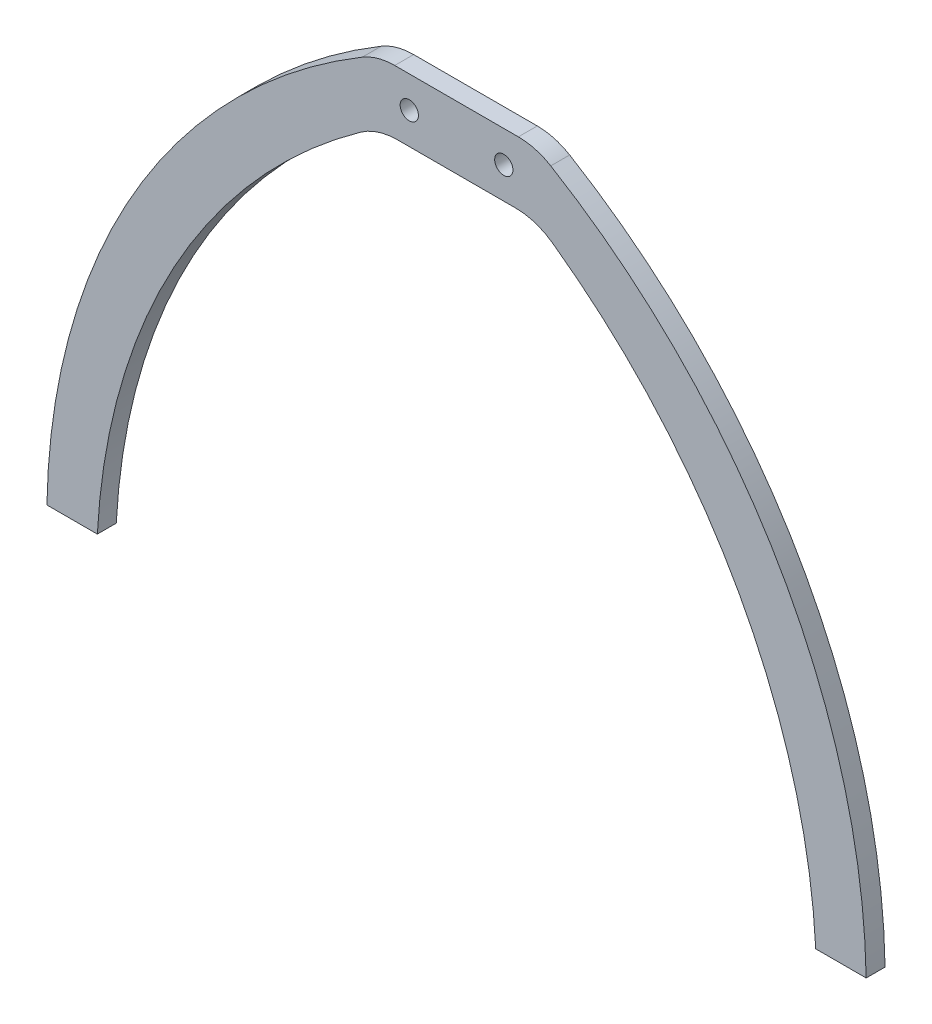
ISO-10303-21;
HEADER;
FILE_DESCRIPTION(('STEP AP214'),'2;1');
FILE_NAME('part.step','',(''),(''),'','','');
FILE_SCHEMA(('AUTOMOTIVE_DESIGN { 1 0 10303 214 1 1 1 1 }'));
ENDSEC;
DATA;
#1=APPLICATION_CONTEXT('core data for automotive mechanical design processes');
#2=APPLICATION_PROTOCOL_DEFINITION('international standard','automotive_design',2000,#1);
#3=PRODUCT_CONTEXT('',#1,'mechanical');
#4=PRODUCT('Part','Part','',(#3));
#5=PRODUCT_RELATED_PRODUCT_CATEGORY('part','',(#4));
#6=PRODUCT_DEFINITION_FORMATION('','',#4);
#7=PRODUCT_DEFINITION_CONTEXT('part definition',#1,'design');
#8=PRODUCT_DEFINITION('design','',#6,#7);
#9=PRODUCT_DEFINITION_SHAPE('','',#8);
#10=(LENGTH_UNIT() NAMED_UNIT(*) SI_UNIT(.MILLI.,.METRE.));
#11=(NAMED_UNIT(*) PLANE_ANGLE_UNIT() SI_UNIT($,.RADIAN.));
#12=(NAMED_UNIT(*) SI_UNIT($,.STERADIAN.) SOLID_ANGLE_UNIT());
#13=UNCERTAINTY_MEASURE_WITH_UNIT(LENGTH_MEASURE(1.E-05),#10,'distance_accuracy_value','');
#14=(GEOMETRIC_REPRESENTATION_CONTEXT(3) GLOBAL_UNCERTAINTY_ASSIGNED_CONTEXT((#13)) GLOBAL_UNIT_ASSIGNED_CONTEXT((#10,
#11,#12)) REPRESENTATION_CONTEXT('',''));
#15=CARTESIAN_POINT('',(0.,0.,0.));
#16=DIRECTION('',(0.,0.,1.));
#17=DIRECTION('',(1.,0.,0.));
#18=AXIS2_PLACEMENT_3D('',#15,#16,#17);
#19=CARTESIAN_POINT('',(55.3606240504215,-83.2778560287661,3.));
#20=DIRECTION('',(0.,0.,1.));
#21=DIRECTION('',(1.,0.,0.));
#22=AXIS2_PLACEMENT_3D('',#19,#20,#21);
#23=PLANE('',#22);
#24=CARTESIAN_POINT('',(5.00000000000002,5.,3.));
#25=DIRECTION('',(0.,0.,1.));
#26=DIRECTION('',(1.,0.,0.));
#27=AXIS2_PLACEMENT_3D('',#24,#25,#26);
#28=CIRCLE('',#27,1.45);
#29=CARTESIAN_POINT('',(6.45000000000001,5.,3.));
#30=VERTEX_POINT('',#29);
#31=EDGE_CURVE('E172',#30,#30,#28,.T.);
#32=ORIENTED_EDGE('',*,*,#31,.F.);
#33=EDGE_LOOP('',(#32));
#34=FACE_BOUND('',#33,.T.);
#35=CARTESIAN_POINT('',(-25.4846323681251,-79.7791840832565,3.));
#36=DIRECTION('',(0.,0.,1.));
#37=DIRECTION('',(-1.,0.,0.));
#38=AXIS2_PLACEMENT_3D('',#35,#36,#37);
#39=CIRCLE('',#38,103.);
#40=CARTESIAN_POINT('',(77.5,-78.,3.));
#41=VERTEX_POINT('',#40);
#42=CARTESIAN_POINT('',(27.4486852804393,8.57840689067273,3.));
#43=VERTEX_POINT('',#42);
#44=EDGE_CURVE('E156',#41,#43,#39,.T.);
#45=ORIENTED_EDGE('',*,*,#44,.T.);
#46=CARTESIAN_POINT('',(22.3095282271806,0.,3.));
#47=DIRECTION('',(0.,0.,1.));
#48=DIRECTION('',(1.,0.,0.));
#49=AXIS2_PLACEMENT_3D('',#46,#47,#48);
#50=CIRCLE('',#49,10.);
#51=CARTESIAN_POINT('',(22.3095282271806,10.,3.));
#52=VERTEX_POINT('',#51);
#53=EDGE_CURVE('E213',#43,#52,#50,.T.);
#54=ORIENTED_EDGE('',*,*,#53,.T.);
#55=DIRECTION('',(-1.,0.,0.));
#56=VECTOR('',#55,1.);
#57=CARTESIAN_POINT('',(0.,10.,3.));
#58=LINE('',#57,#56);
#59=CARTESIAN_POINT('',(2.69047177281938,10.,3.));
#60=VERTEX_POINT('',#59);
#61=EDGE_CURVE('E158',#52,#60,#58,.T.);
#62=ORIENTED_EDGE('',*,*,#61,.T.);
#63=CARTESIAN_POINT('',(2.69047177281938,0.,3.));
#64=DIRECTION('',(0.,0.,1.));
#65=DIRECTION('',(1.,0.,0.));
#66=AXIS2_PLACEMENT_3D('',#63,#64,#65);
#67=CIRCLE('',#66,10.);
#68=CARTESIAN_POINT('',(-2.4486852804393,8.57840689067274,3.));
#69=VERTEX_POINT('',#68);
#70=EDGE_CURVE('E56',#60,#69,#67,.T.);
#71=ORIENTED_EDGE('',*,*,#70,.T.);
#72=CARTESIAN_POINT('',(50.4846323681251,-79.7791840832565,3.));
#73=DIRECTION('',(0.,0.,1.));
#74=DIRECTION('',(1.,0.,0.));
#75=AXIS2_PLACEMENT_3D('',#72,#73,#74);
#76=CIRCLE('',#75,103.);
#77=CARTESIAN_POINT('',(-52.5,-78.,3.));
#78=VERTEX_POINT('',#77);
#79=EDGE_CURVE('E163',#69,#78,#76,.T.);
#80=ORIENTED_EDGE('',*,*,#79,.T.);
#81=DIRECTION('',(1.,0.,0.));
#82=VECTOR('',#81,1.);
#83=CARTESIAN_POINT('',(-52.5,-78.,3.));
#84=LINE('',#83,#82);
#85=CARTESIAN_POINT('',(-44.5,-78.,3.));
#86=VERTEX_POINT('',#85);
#87=EDGE_CURVE('E165',#78,#86,#84,.T.);
#88=ORIENTED_EDGE('',*,*,#87,.T.);
#89=CARTESIAN_POINT('',(55.3606240504215,-83.2778560287661,3.));
#90=DIRECTION('',(0.,0.,-1.));
#91=DIRECTION('',(1.,0.,0.));
#92=AXIS2_PLACEMENT_3D('',#89,#90,#91);
#93=CIRCLE('',#92,100.);
#94=CARTESIAN_POINT('',(-2.69805014361831,-1.85801599680376,3.));
#95=VERTEX_POINT('',#94);
#96=EDGE_CURVE('E187',#86,#95,#93,.T.);
#97=ORIENTED_EDGE('',*,*,#96,.T.);
#98=CARTESIAN_POINT('',(3.10781727578567,-9.99999999999999,3.));
#99=DIRECTION('',(0.,0.,1.));
#100=DIRECTION('',(1.,0.,0.));
#101=AXIS2_PLACEMENT_3D('',#98,#99,#100);
#102=CIRCLE('',#101,10.);
#103=CARTESIAN_POINT('',(3.10781727578567,0.,3.));
#104=VERTEX_POINT('',#103);
#105=EDGE_CURVE('E11',#95,#104,#102,.F.);
#106=ORIENTED_EDGE('',*,*,#105,.T.);
#107=DIRECTION('',(1.,0.,0.));
#108=VECTOR('',#107,1.);
#109=CARTESIAN_POINT('',(0.,0.,3.));
#110=LINE('',#109,#108);
#111=CARTESIAN_POINT('',(21.8921827242143,0.,3.));
#112=VERTEX_POINT('',#111);
#113=EDGE_CURVE('E142',#104,#112,#110,.T.);
#114=ORIENTED_EDGE('',*,*,#113,.T.);
#115=CARTESIAN_POINT('',(21.8921827242143,-9.99999999999999,3.));
#116=DIRECTION('',(0.,0.,1.));
#117=DIRECTION('',(1.,0.,0.));
#118=AXIS2_PLACEMENT_3D('',#115,#116,#117);
#119=CIRCLE('',#118,10.);
#120=CARTESIAN_POINT('',(27.6980501436183,-1.85801599680377,3.));
#121=VERTEX_POINT('',#120);
#122=EDGE_CURVE('E138',#112,#121,#119,.F.);
#123=ORIENTED_EDGE('',*,*,#122,.T.);
#124=CARTESIAN_POINT('',(-30.3606240504215,-83.2778560287661,3.));
#125=DIRECTION('',(0.,0.,-1.));
#126=DIRECTION('',(-1.,0.,0.));
#127=AXIS2_PLACEMENT_3D('',#124,#125,#126);
#128=CIRCLE('',#127,100.);
#129=CARTESIAN_POINT('',(69.5,-78.,3.));
#130=VERTEX_POINT('',#129);
#131=EDGE_CURVE('E130',#121,#130,#128,.T.);
#132=ORIENTED_EDGE('',*,*,#131,.T.);
#133=DIRECTION('',(1.,0.,0.));
#134=VECTOR('',#133,1.);
#135=CARTESIAN_POINT('',(69.5,-78.,3.));
#136=LINE('',#135,#134);
#137=EDGE_CURVE('E134',#130,#41,#136,.T.);
#138=ORIENTED_EDGE('',*,*,#137,.T.);
#139=EDGE_LOOP('',(#45,#54,#62,#71,#80,#88,#97,#106,#114,#123,#132,#138));
#140=FACE_BOUND('',#139,.T.);
#141=CARTESIAN_POINT('',(20.,5.,3.));
#142=DIRECTION('',(0.,0.,1.));
#143=DIRECTION('',(1.,0.,0.));
#144=AXIS2_PLACEMENT_3D('',#141,#142,#143);
#145=CIRCLE('',#144,1.45);
#146=CARTESIAN_POINT('',(21.45,5.,3.));
#147=VERTEX_POINT('',#146);
#148=EDGE_CURVE('E246',#147,#147,#145,.T.);
#149=ORIENTED_EDGE('',*,*,#148,.F.);
#150=EDGE_LOOP('',(#149));
#151=FACE_BOUND('',#150,.T.);
#152=ADVANCED_FACE('F41',(#34,#140,#151),#23,.T.);
#153=CARTESIAN_POINT('',(55.3606240504215,-83.2778560287661,0.));
#154=DIRECTION('',(0.,0.,1.));
#155=DIRECTION('',(1.,0.,0.));
#156=AXIS2_PLACEMENT_3D('',#153,#154,#155);
#157=PLANE('',#156);
#158=DIRECTION('',(-1.,0.,0.));
#159=VECTOR('',#158,1.);
#160=CARTESIAN_POINT('',(0.,10.,0.));
#161=LINE('',#160,#159);
#162=CARTESIAN_POINT('',(22.3095282271806,10.,0.));
#163=VERTEX_POINT('',#162);
#164=CARTESIAN_POINT('',(2.69047177281938,10.,0.));
#165=VERTEX_POINT('',#164);
#166=EDGE_CURVE('E180',#163,#165,#161,.T.);
#167=ORIENTED_EDGE('',*,*,#166,.F.);
#168=CARTESIAN_POINT('',(22.3095282271806,0.,0.));
#169=DIRECTION('',(0.,0.,1.));
#170=DIRECTION('',(1.,0.,0.));
#171=AXIS2_PLACEMENT_3D('',#168,#169,#170);
#172=CIRCLE('',#171,10.);
#173=CARTESIAN_POINT('',(27.4486852804393,8.57840689067273,0.));
#174=VERTEX_POINT('',#173);
#175=EDGE_CURVE('E209',#163,#174,#172,.F.);
#176=ORIENTED_EDGE('',*,*,#175,.T.);
#177=CARTESIAN_POINT('',(-25.4846323681251,-79.7791840832565,0.));
#178=DIRECTION('',(0.,0.,1.));
#179=DIRECTION('',(-1.,0.,0.));
#180=AXIS2_PLACEMENT_3D('',#177,#178,#179);
#181=CIRCLE('',#180,103.);
#182=CARTESIAN_POINT('',(77.5,-78.,0.));
#183=VERTEX_POINT('',#182);
#184=EDGE_CURVE('E178',#183,#174,#181,.T.);
#185=ORIENTED_EDGE('',*,*,#184,.F.);
#186=DIRECTION('',(1.,0.,0.));
#187=VECTOR('',#186,1.);
#188=CARTESIAN_POINT('',(69.5,-78.,0.));
#189=LINE('',#188,#187);
#190=CARTESIAN_POINT('',(69.5,-78.,0.));
#191=VERTEX_POINT('',#190);
#192=EDGE_CURVE('E176',#191,#183,#189,.T.);
#193=ORIENTED_EDGE('',*,*,#192,.F.);
#194=CARTESIAN_POINT('',(-30.3606240504215,-83.2778560287661,0.));
#195=DIRECTION('',(0.,0.,-1.));
#196=DIRECTION('',(-1.,0.,0.));
#197=AXIS2_PLACEMENT_3D('',#194,#195,#196);
#198=CIRCLE('',#197,100.);
#199=CARTESIAN_POINT('',(27.6980501436183,-1.85801599680377,0.));
#200=VERTEX_POINT('',#199);
#201=EDGE_CURVE('E148',#200,#191,#198,.T.);
#202=ORIENTED_EDGE('',*,*,#201,.F.);
#203=CARTESIAN_POINT('',(21.8921827242143,-9.99999999999999,0.));
#204=DIRECTION('',(0.,0.,1.));
#205=DIRECTION('',(1.,0.,0.));
#206=AXIS2_PLACEMENT_3D('',#203,#204,#205);
#207=CIRCLE('',#206,10.);
#208=CARTESIAN_POINT('',(21.8921827242143,0.,0.));
#209=VERTEX_POINT('',#208);
#210=EDGE_CURVE('E218',#200,#209,#207,.T.);
#211=ORIENTED_EDGE('',*,*,#210,.T.);
#212=DIRECTION('',(1.,0.,0.));
#213=VECTOR('',#212,1.);
#214=CARTESIAN_POINT('',(0.,0.,0.));
#215=LINE('',#214,#213);
#216=CARTESIAN_POINT('',(3.10781727578567,0.,0.));
#217=VERTEX_POINT('',#216);
#218=EDGE_CURVE('E171',#217,#209,#215,.T.);
#219=ORIENTED_EDGE('',*,*,#218,.F.);
#220=CARTESIAN_POINT('',(3.10781727578567,-9.99999999999999,0.));
#221=DIRECTION('',(0.,0.,1.));
#222=DIRECTION('',(1.,0.,0.));
#223=AXIS2_PLACEMENT_3D('',#220,#221,#222);
#224=CIRCLE('',#223,10.);
#225=CARTESIAN_POINT('',(-2.69805014361831,-1.85801599680376,0.));
#226=VERTEX_POINT('',#225);
#227=EDGE_CURVE('E49',#217,#226,#224,.T.);
#228=ORIENTED_EDGE('',*,*,#227,.T.);
#229=CARTESIAN_POINT('',(55.3606240504215,-83.2778560287661,0.));
#230=DIRECTION('',(0.,0.,-1.));
#231=DIRECTION('',(1.,0.,0.));
#232=AXIS2_PLACEMENT_3D('',#229,#230,#231);
#233=CIRCLE('',#232,100.);
#234=CARTESIAN_POINT('',(-44.5,-78.,0.));
#235=VERTEX_POINT('',#234);
#236=EDGE_CURVE('E168',#235,#226,#233,.T.);
#237=ORIENTED_EDGE('',*,*,#236,.F.);
#238=DIRECTION('',(1.,0.,0.));
#239=VECTOR('',#238,1.);
#240=CARTESIAN_POINT('',(-52.5,-78.,0.));
#241=LINE('',#240,#239);
#242=CARTESIAN_POINT('',(-52.5,-78.,0.));
#243=VERTEX_POINT('',#242);
#244=EDGE_CURVE('E185',#243,#235,#241,.T.);
#245=ORIENTED_EDGE('',*,*,#244,.F.);
#246=CARTESIAN_POINT('',(50.4846323681251,-79.7791840832565,0.));
#247=DIRECTION('',(0.,0.,1.));
#248=DIRECTION('',(1.,0.,0.));
#249=AXIS2_PLACEMENT_3D('',#246,#247,#248);
#250=CIRCLE('',#249,103.);
#251=CARTESIAN_POINT('',(-2.4486852804393,8.57840689067274,0.));
#252=VERTEX_POINT('',#251);
#253=EDGE_CURVE('E183',#252,#243,#250,.T.);
#254=ORIENTED_EDGE('',*,*,#253,.F.);
#255=CARTESIAN_POINT('',(2.69047177281938,0.,0.));
#256=DIRECTION('',(0.,0.,1.));
#257=DIRECTION('',(1.,0.,0.));
#258=AXIS2_PLACEMENT_3D('',#255,#256,#257);
#259=CIRCLE('',#258,10.);
#260=EDGE_CURVE('E207',#252,#165,#259,.F.);
#261=ORIENTED_EDGE('',*,*,#260,.T.);
#262=EDGE_LOOP('',(#167,#176,#185,#193,#202,#211,#219,#228,#237,#245,#254,#261));
#263=FACE_BOUND('',#262,.T.);
#264=CARTESIAN_POINT('',(5.00000000000002,5.,0.));
#265=DIRECTION('',(0.,0.,1.));
#266=DIRECTION('',(1.,0.,0.));
#267=AXIS2_PLACEMENT_3D('',#264,#265,#266);
#268=CIRCLE('',#267,1.45);
#269=CARTESIAN_POINT('',(6.45000000000001,5.,0.));
#270=VERTEX_POINT('',#269);
#271=EDGE_CURVE('E243',#270,#270,#268,.T.);
#272=ORIENTED_EDGE('',*,*,#271,.T.);
#273=EDGE_LOOP('',(#272));
#274=FACE_BOUND('',#273,.T.);
#275=CARTESIAN_POINT('',(20.,5.,0.));
#276=DIRECTION('',(0.,0.,1.));
#277=DIRECTION('',(1.,0.,0.));
#278=AXIS2_PLACEMENT_3D('',#275,#276,#277);
#279=CIRCLE('',#278,1.45);
#280=CARTESIAN_POINT('',(21.45,5.,0.));
#281=VERTEX_POINT('',#280);
#282=EDGE_CURVE('E249',#281,#281,#279,.T.);
#283=ORIENTED_EDGE('',*,*,#282,.T.);
#284=EDGE_LOOP('',(#283));
#285=FACE_BOUND('',#284,.T.);
#286=ADVANCED_FACE('F224',(#263,#274,#285),#157,.F.);
#287=CARTESIAN_POINT('',(55.3606240504215,-83.2778560287661,3.));
#288=DIRECTION('',(0.,0.,-1.));
#289=DIRECTION('',(-1.,0.,0.));
#290=AXIS2_PLACEMENT_3D('',#287,#288,#289);
#291=CYLINDRICAL_SURFACE('',#290,100.);
#292=ORIENTED_EDGE('',*,*,#236,.T.);
#293=DIRECTION('',(0.,0.,-1.));
#294=VECTOR('',#293,1.);
#295=CARTESIAN_POINT('',(-2.69805014361832,-1.85801599680376,3.));
#296=LINE('',#295,#294);
#297=EDGE_CURVE('E200',#226,#95,#296,.F.);
#298=ORIENTED_EDGE('',*,*,#297,.T.);
#299=ORIENTED_EDGE('',*,*,#96,.F.);
#300=DIRECTION('',(0.,0.,-1.));
#301=VECTOR('',#300,1.);
#302=CARTESIAN_POINT('',(-44.5,-78.,3.));
#303=LINE('',#302,#301);
#304=EDGE_CURVE('E167',#86,#235,#303,.T.);
#305=ORIENTED_EDGE('',*,*,#304,.T.);
#306=EDGE_LOOP('',(#292,#298,#299,#305));
#307=FACE_BOUND('',#306,.T.);
#308=ADVANCED_FACE('F231',(#307),#291,.F.);
#309=CARTESIAN_POINT('',(0.,0.,3.));
#310=DIRECTION('',(0.,1.,0.));
#311=DIRECTION('',(0.,0.,1.));
#312=AXIS2_PLACEMENT_3D('',#309,#310,#311);
#313=PLANE('',#312);
#314=ORIENTED_EDGE('',*,*,#218,.T.);
#315=DIRECTION('',(0.,0.,1.));
#316=VECTOR('',#315,1.);
#317=CARTESIAN_POINT('',(21.8921827242143,0.,3.));
#318=LINE('',#317,#316);
#319=EDGE_CURVE('E198',#209,#112,#318,.T.);
#320=ORIENTED_EDGE('',*,*,#319,.T.);
#321=ORIENTED_EDGE('',*,*,#113,.F.);
#322=DIRECTION('',(0.,0.,1.));
#323=VECTOR('',#322,1.);
#324=CARTESIAN_POINT('',(3.10781727578567,0.,0.));
#325=LINE('',#324,#323);
#326=EDGE_CURVE('E195',#104,#217,#325,.F.);
#327=ORIENTED_EDGE('',*,*,#326,.T.);
#328=EDGE_LOOP('',(#314,#320,#321,#327));
#329=FACE_BOUND('',#328,.T.);
#330=ADVANCED_FACE('F239',(#329),#313,.F.);
#331=CARTESIAN_POINT('',(-30.3606240504215,-83.2778560287661,3.));
#332=DIRECTION('',(0.,0.,-1.));
#333=DIRECTION('',(-1.,0.,0.));
#334=AXIS2_PLACEMENT_3D('',#331,#332,#333);
#335=CYLINDRICAL_SURFACE('',#334,100.);
#336=ORIENTED_EDGE('',*,*,#131,.F.);
#337=DIRECTION('',(0.,0.,-1.));
#338=VECTOR('',#337,1.);
#339=CARTESIAN_POINT('',(27.6980501436183,-1.85801599680376,3.));
#340=LINE('',#339,#338);
#341=EDGE_CURVE('E151',#121,#200,#340,.T.);
#342=ORIENTED_EDGE('',*,*,#341,.T.);
#343=ORIENTED_EDGE('',*,*,#201,.T.);
#344=DIRECTION('',(0.,0.,-1.));
#345=VECTOR('',#344,1.);
#346=CARTESIAN_POINT('',(69.5,-78.,3.));
#347=LINE('',#346,#345);
#348=EDGE_CURVE('E145',#130,#191,#347,.T.);
#349=ORIENTED_EDGE('',*,*,#348,.F.);
#350=EDGE_LOOP('',(#336,#342,#343,#349));
#351=FACE_BOUND('',#350,.T.);
#352=ADVANCED_FACE('F146',(#351),#335,.F.);
#353=CARTESIAN_POINT('',(69.5,-78.,3.));
#354=DIRECTION('',(0.,1.,0.));
#355=DIRECTION('',(-1.,0.,0.));
#356=AXIS2_PLACEMENT_3D('',#353,#354,#355);
#357=PLANE('',#356);
#358=ORIENTED_EDGE('',*,*,#192,.T.);
#359=DIRECTION('',(0.,0.,-1.));
#360=VECTOR('',#359,1.);
#361=CARTESIAN_POINT('',(77.5,-78.,3.));
#362=LINE('',#361,#360);
#363=EDGE_CURVE('E152',#41,#183,#362,.T.);
#364=ORIENTED_EDGE('',*,*,#363,.F.);
#365=ORIENTED_EDGE('',*,*,#137,.F.);
#366=ORIENTED_EDGE('',*,*,#348,.T.);
#367=EDGE_LOOP('',(#358,#364,#365,#366));
#368=FACE_BOUND('',#367,.T.);
#369=ADVANCED_FACE('F154',(#368),#357,.F.);
#370=CARTESIAN_POINT('',(-25.4846323681251,-79.7791840832565,3.));
#371=DIRECTION('',(0.,0.,-1.));
#372=DIRECTION('',(-1.,0.,0.));
#373=AXIS2_PLACEMENT_3D('',#370,#371,#372);
#374=CYLINDRICAL_SURFACE('',#373,103.);
#375=ORIENTED_EDGE('',*,*,#184,.T.);
#376=DIRECTION('',(0.,0.,-1.));
#377=VECTOR('',#376,1.);
#378=CARTESIAN_POINT('',(27.4486852804393,8.57840689067275,3.));
#379=LINE('',#378,#377);
#380=EDGE_CURVE('E64',#174,#43,#379,.F.);
#381=ORIENTED_EDGE('',*,*,#380,.T.);
#382=ORIENTED_EDGE('',*,*,#44,.F.);
#383=ORIENTED_EDGE('',*,*,#363,.T.);
#384=EDGE_LOOP('',(#375,#381,#382,#383));
#385=FACE_BOUND('',#384,.T.);
#386=ADVANCED_FACE('F281',(#385),#374,.T.);
#387=CARTESIAN_POINT('',(0.,10.,3.));
#388=DIRECTION('',(0.,-1.,0.));
#389=DIRECTION('',(0.,0.,-1.));
#390=AXIS2_PLACEMENT_3D('',#387,#388,#389);
#391=PLANE('',#390);
#392=ORIENTED_EDGE('',*,*,#61,.F.);
#393=DIRECTION('',(0.,0.,-1.));
#394=VECTOR('',#393,1.);
#395=CARTESIAN_POINT('',(22.3095282271806,10.,3.));
#396=LINE('',#395,#394);
#397=EDGE_CURVE('E204',#52,#163,#396,.T.);
#398=ORIENTED_EDGE('',*,*,#397,.T.);
#399=ORIENTED_EDGE('',*,*,#166,.T.);
#400=DIRECTION('',(0.,0.,-1.));
#401=VECTOR('',#400,1.);
#402=CARTESIAN_POINT('',(2.69047177281938,10.,3.));
#403=LINE('',#402,#401);
#404=EDGE_CURVE('E202',#165,#60,#403,.F.);
#405=ORIENTED_EDGE('',*,*,#404,.T.);
#406=EDGE_LOOP('',(#392,#398,#399,#405));
#407=FACE_BOUND('',#406,.T.);
#408=ADVANCED_FACE('F277',(#407),#391,.F.);
#409=CARTESIAN_POINT('',(50.4846323681251,-79.7791840832565,3.));
#410=DIRECTION('',(0.,0.,-1.));
#411=DIRECTION('',(-1.,0.,0.));
#412=AXIS2_PLACEMENT_3D('',#409,#410,#411);
#413=CYLINDRICAL_SURFACE('',#412,103.);
#414=ORIENTED_EDGE('',*,*,#79,.F.);
#415=DIRECTION('',(0.,0.,-1.));
#416=VECTOR('',#415,1.);
#417=CARTESIAN_POINT('',(-2.4486852804393,8.57840689067274,3.));
#418=LINE('',#417,#416);
#419=EDGE_CURVE('E215',#69,#252,#418,.T.);
#420=ORIENTED_EDGE('',*,*,#419,.T.);
#421=ORIENTED_EDGE('',*,*,#253,.T.);
#422=DIRECTION('',(0.,0.,-1.));
#423=VECTOR('',#422,1.);
#424=CARTESIAN_POINT('',(-52.5,-78.,3.));
#425=LINE('',#424,#423);
#426=EDGE_CURVE('E190',#78,#243,#425,.T.);
#427=ORIENTED_EDGE('',*,*,#426,.F.);
#428=EDGE_LOOP('',(#414,#420,#421,#427));
#429=FACE_BOUND('',#428,.T.);
#430=ADVANCED_FACE('F273',(#429),#413,.T.);
#431=CARTESIAN_POINT('',(-52.5,-78.,3.));
#432=DIRECTION('',(0.,1.,0.));
#433=DIRECTION('',(0.,0.,1.));
#434=AXIS2_PLACEMENT_3D('',#431,#432,#433);
#435=PLANE('',#434);
#436=ORIENTED_EDGE('',*,*,#244,.T.);
#437=ORIENTED_EDGE('',*,*,#304,.F.);
#438=ORIENTED_EDGE('',*,*,#87,.F.);
#439=ORIENTED_EDGE('',*,*,#426,.T.);
#440=EDGE_LOOP('',(#436,#437,#438,#439));
#441=FACE_BOUND('',#440,.T.);
#442=ADVANCED_FACE('F270',(#441),#435,.F.);
#443=CARTESIAN_POINT('',(5.00000000000002,5.,3.));
#444=DIRECTION('',(0.,0.,-1.));
#445=DIRECTION('',(-1.,0.,0.));
#446=AXIS2_PLACEMENT_3D('',#443,#444,#445);
#447=CYLINDRICAL_SURFACE('',#446,1.45);
#448=ORIENTED_EDGE('',*,*,#31,.T.);
#449=EDGE_LOOP('',(#448));
#450=FACE_BOUND('',#449,.T.);
#451=ORIENTED_EDGE('',*,*,#271,.F.);
#452=EDGE_LOOP('',(#451));
#453=FACE_BOUND('',#452,.T.);
#454=ADVANCED_FACE('F267',(#450,#453),#447,.F.);
#455=CARTESIAN_POINT('',(20.,5.,3.));
#456=DIRECTION('',(0.,0.,-1.));
#457=DIRECTION('',(-1.,0.,0.));
#458=AXIS2_PLACEMENT_3D('',#455,#456,#457);
#459=CYLINDRICAL_SURFACE('',#458,1.45);
#460=ORIENTED_EDGE('',*,*,#148,.T.);
#461=EDGE_LOOP('',(#460));
#462=FACE_BOUND('',#461,.T.);
#463=ORIENTED_EDGE('',*,*,#282,.F.);
#464=EDGE_LOOP('',(#463));
#465=FACE_BOUND('',#464,.T.);
#466=ADVANCED_FACE('F255',(#462,#465),#459,.F.);
#467=CARTESIAN_POINT('',(21.8921827242143,-9.99999999999999,3.));
#468=DIRECTION('',(0.,0.,-1.));
#469=DIRECTION('',(-1.,0.,0.));
#470=AXIS2_PLACEMENT_3D('',#467,#468,#469);
#471=CYLINDRICAL_SURFACE('',#470,10.);
#472=ORIENTED_EDGE('',*,*,#122,.F.);
#473=ORIENTED_EDGE('',*,*,#319,.F.);
#474=ORIENTED_EDGE('',*,*,#210,.F.);
#475=ORIENTED_EDGE('',*,*,#341,.F.);
#476=EDGE_LOOP('',(#472,#473,#474,#475));
#477=FACE_BOUND('',#476,.T.);
#478=ADVANCED_FACE('F293',(#477),#471,.F.);
#479=CARTESIAN_POINT('',(3.10781727578567,-9.99999999999999,3.));
#480=DIRECTION('',(0.,0.,-1.));
#481=DIRECTION('',(-1.,0.,0.));
#482=AXIS2_PLACEMENT_3D('',#479,#480,#481);
#483=CYLINDRICAL_SURFACE('',#482,10.);
#484=ORIENTED_EDGE('',*,*,#105,.F.);
#485=ORIENTED_EDGE('',*,*,#297,.F.);
#486=ORIENTED_EDGE('',*,*,#227,.F.);
#487=ORIENTED_EDGE('',*,*,#326,.F.);
#488=EDGE_LOOP('',(#484,#485,#486,#487));
#489=FACE_BOUND('',#488,.T.);
#490=ADVANCED_FACE('F236',(#489),#483,.F.);
#491=CARTESIAN_POINT('',(22.3095282271806,0.,3.));
#492=DIRECTION('',(0.,0.,-1.));
#493=DIRECTION('',(-1.,0.,0.));
#494=AXIS2_PLACEMENT_3D('',#491,#492,#493);
#495=CYLINDRICAL_SURFACE('',#494,10.);
#496=ORIENTED_EDGE('',*,*,#53,.F.);
#497=ORIENTED_EDGE('',*,*,#380,.F.);
#498=ORIENTED_EDGE('',*,*,#175,.F.);
#499=ORIENTED_EDGE('',*,*,#397,.F.);
#500=EDGE_LOOP('',(#496,#497,#498,#499));
#501=FACE_BOUND('',#500,.T.);
#502=ADVANCED_FACE('F298',(#501),#495,.T.);
#503=CARTESIAN_POINT('',(2.69047177281938,0.,3.));
#504=DIRECTION('',(0.,0.,-1.));
#505=DIRECTION('',(-1.,0.,0.));
#506=AXIS2_PLACEMENT_3D('',#503,#504,#505);
#507=CYLINDRICAL_SURFACE('',#506,10.);
#508=ORIENTED_EDGE('',*,*,#70,.F.);
#509=ORIENTED_EDGE('',*,*,#404,.F.);
#510=ORIENTED_EDGE('',*,*,#260,.F.);
#511=ORIENTED_EDGE('',*,*,#419,.F.);
#512=EDGE_LOOP('',(#508,#509,#510,#511));
#513=FACE_BOUND('',#512,.T.);
#514=ADVANCED_FACE('F43',(#513),#507,.T.);
#515=CLOSED_SHELL('',(#152,#286,#308,#330,#352,#369,#386,#408,#430,#442,#454,#466,#478,#490,
#502,#514));
#516=MANIFOLD_SOLID_BREP('B2',#515);
#517=ADVANCED_BREP_SHAPE_REPRESENTATION('',(#18,#516),#14);
#518=SHAPE_DEFINITION_REPRESENTATION(#9,#517);
ENDSEC;
END-ISO-10303-21;
